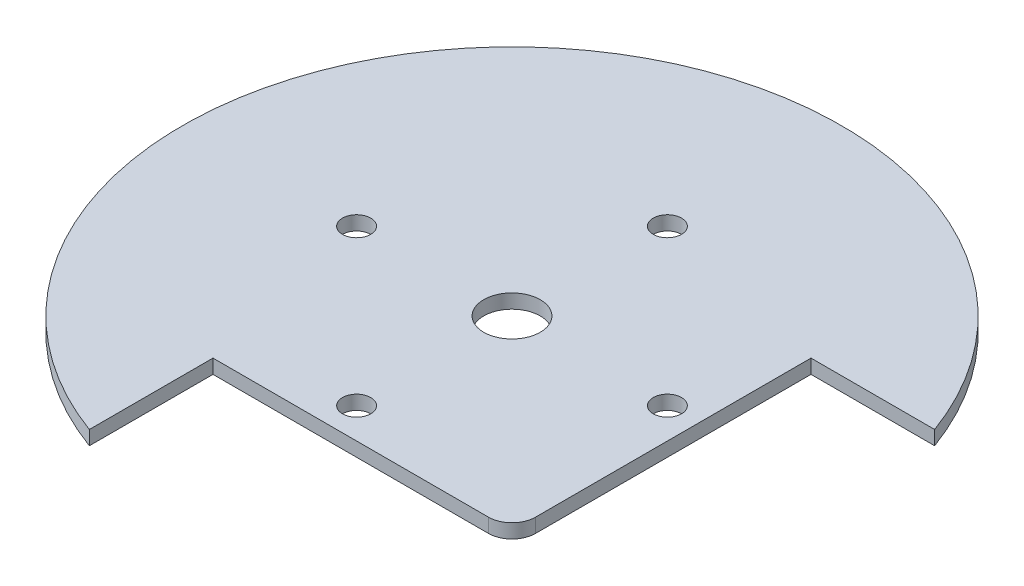
ISO-10303-21;
HEADER;
FILE_DESCRIPTION(('STEP AP214'),'2;1');
FILE_NAME('part.step','',(''),(''),'','','');
FILE_SCHEMA(('AUTOMOTIVE_DESIGN { 1 0 10303 214 1 1 1 1 }'));
ENDSEC;
DATA;
#1=APPLICATION_CONTEXT('core data for automotive mechanical design processes');
#2=APPLICATION_PROTOCOL_DEFINITION('international standard','automotive_design',2000,#1);
#3=PRODUCT_CONTEXT('',#1,'mechanical');
#4=PRODUCT('Part','Part','',(#3));
#5=PRODUCT_RELATED_PRODUCT_CATEGORY('part','',(#4));
#6=PRODUCT_DEFINITION_FORMATION('','',#4);
#7=PRODUCT_DEFINITION_CONTEXT('part definition',#1,'design');
#8=PRODUCT_DEFINITION('design','',#6,#7);
#9=PRODUCT_DEFINITION_SHAPE('','',#8);
#10=(LENGTH_UNIT() NAMED_UNIT(*) SI_UNIT(.MILLI.,.METRE.));
#11=(NAMED_UNIT(*) PLANE_ANGLE_UNIT() SI_UNIT($,.RADIAN.));
#12=(NAMED_UNIT(*) SI_UNIT($,.STERADIAN.) SOLID_ANGLE_UNIT());
#13=UNCERTAINTY_MEASURE_WITH_UNIT(LENGTH_MEASURE(1.E-05),#10,'distance_accuracy_value','');
#14=(GEOMETRIC_REPRESENTATION_CONTEXT(3) GLOBAL_UNCERTAINTY_ASSIGNED_CONTEXT((#13)) GLOBAL_UNIT_ASSIGNED_CONTEXT((#10,
#11,#12)) REPRESENTATION_CONTEXT('',''));
#15=CARTESIAN_POINT('',(0.,0.,0.));
#16=DIRECTION('',(0.,0.,1.));
#17=DIRECTION('',(1.,0.,0.));
#18=AXIS2_PLACEMENT_3D('',#15,#16,#17);
#19=CARTESIAN_POINT('',(34.4999999999993,3.,34.4999999999994));
#20=DIRECTION('',(0.,-1.,0.));
#21=DIRECTION('',(0.,0.,-1.));
#22=AXIS2_PLACEMENT_3D('',#19,#20,#21);
#23=PLANE('',#22);
#24=CARTESIAN_POINT('',(34.4999999999993,3.,34.4999999999994));
#25=DIRECTION('',(0.,1.,0.));
#26=DIRECTION('',(0.,0.,-1.));
#27=AXIS2_PLACEMENT_3D('',#24,#25,#26);
#28=CIRCLE('',#27,5.);
#29=CARTESIAN_POINT('',(34.4999999999996,3.,39.4999999999994));
#30=VERTEX_POINT('',#29);
#31=CARTESIAN_POINT('',(39.4999999999993,3.,34.4999999999996));
#32=VERTEX_POINT('',#31);
#33=EDGE_CURVE('E130',#30,#32,#28,.T.);
#34=ORIENTED_EDGE('',*,*,#33,.T.);
#35=DIRECTION('',(0.,0.,-1.));
#36=VECTOR('',#35,1.);
#37=CARTESIAN_POINT('',(39.4999999999993,3.,34.4999999999996));
#38=LINE('',#37,#36);
#39=CARTESIAN_POINT('',(39.5000000000002,3.,-23.9999999999996));
#40=VERTEX_POINT('',#39);
#41=EDGE_CURVE('E84',#32,#40,#38,.T.);
#42=ORIENTED_EDGE('',*,*,#41,.T.);
#43=DIRECTION('',(1.,0.,0.));
#44=VECTOR('',#43,1.);
#45=CARTESIAN_POINT('',(39.5000000000002,3.,-23.9999999999996));
#46=LINE('',#45,#44);
#47=CARTESIAN_POINT('',(65.7571288910946,3.,-23.9999999999993));
#48=VERTEX_POINT('',#47);
#49=EDGE_CURVE('E98',#40,#48,#46,.T.);
#50=ORIENTED_EDGE('',*,*,#49,.T.);
#51=CARTESIAN_POINT('',(0.,3.,0.));
#52=DIRECTION('',(0.,1.,0.));
#53=DIRECTION('',(0.,0.,1.));
#54=AXIS2_PLACEMENT_3D('',#51,#52,#53);
#55=CIRCLE('',#54,70.);
#56=CARTESIAN_POINT('',(-24.,3.,65.7571288910944));
#57=VERTEX_POINT('',#56);
#58=EDGE_CURVE('E91',#48,#57,#55,.T.);
#59=ORIENTED_EDGE('',*,*,#58,.T.);
#60=DIRECTION('',(0.,0.,-1.));
#61=VECTOR('',#60,1.);
#62=CARTESIAN_POINT('',(-24.,3.,39.5));
#63=LINE('',#62,#61);
#64=CARTESIAN_POINT('',(-24.,3.,39.5));
#65=VERTEX_POINT('',#64);
#66=EDGE_CURVE('E95',#57,#65,#63,.T.);
#67=ORIENTED_EDGE('',*,*,#66,.T.);
#68=DIRECTION('',(1.,0.,0.));
#69=VECTOR('',#68,1.);
#70=CARTESIAN_POINT('',(-24.,3.,39.5));
#71=LINE('',#70,#69);
#72=EDGE_CURVE('E49',#65,#30,#71,.T.);
#73=ORIENTED_EDGE('',*,*,#72,.T.);
#74=EDGE_LOOP('',(#34,#42,#50,#59,#67,#73));
#75=FACE_BOUND('',#74,.T.);
#76=CARTESIAN_POINT('',(0.,3.,0.));
#77=DIRECTION('',(0.,1.,0.));
#78=DIRECTION('',(0.,0.,1.));
#79=AXIS2_PLACEMENT_3D('',#76,#77,#78);
#80=CIRCLE('',#79,6.);
#81=CARTESIAN_POINT('',(0.,3.,6.));
#82=VERTEX_POINT('',#81);
#83=EDGE_CURVE('E122',#82,#82,#80,.T.);
#84=ORIENTED_EDGE('',*,*,#83,.F.);
#85=EDGE_LOOP('',(#84));
#86=FACE_BOUND('',#85,.T.);
#87=CARTESIAN_POINT('',(33.,3.,0.));
#88=DIRECTION('',(0.,1.,0.));
#89=DIRECTION('',(0.,0.,1.));
#90=AXIS2_PLACEMENT_3D('',#87,#88,#89);
#91=CIRCLE('',#90,3.);
#92=CARTESIAN_POINT('',(33.,3.,3.));
#93=VERTEX_POINT('',#92);
#94=EDGE_CURVE('E149',#93,#93,#91,.T.);
#95=ORIENTED_EDGE('',*,*,#94,.F.);
#96=EDGE_LOOP('',(#95));
#97=FACE_BOUND('',#96,.T.);
#98=CARTESIAN_POINT('',(-1.15218884181823E-13,3.,33.));
#99=DIRECTION('',(0.,1.,0.));
#100=DIRECTION('',(0.,0.,1.));
#101=AXIS2_PLACEMENT_3D('',#98,#99,#100);
#102=CIRCLE('',#101,3.);
#103=CARTESIAN_POINT('',(-1.15218884181823E-13,3.,36.));
#104=VERTEX_POINT('',#103);
#105=EDGE_CURVE('E155',#104,#104,#102,.T.);
#106=ORIENTED_EDGE('',*,*,#105,.F.);
#107=EDGE_LOOP('',(#106));
#108=FACE_BOUND('',#107,.T.);
#109=CARTESIAN_POINT('',(-33.,3.,-2.30437768363647E-13));
#110=DIRECTION('',(0.,1.,0.));
#111=DIRECTION('',(0.,0.,1.));
#112=AXIS2_PLACEMENT_3D('',#109,#110,#111);
#113=CIRCLE('',#112,3.);
#114=CARTESIAN_POINT('',(-33.,3.,2.99999999999977));
#115=VERTEX_POINT('',#114);
#116=EDGE_CURVE('E161',#115,#115,#113,.T.);
#117=ORIENTED_EDGE('',*,*,#116,.F.);
#118=EDGE_LOOP('',(#117));
#119=FACE_BOUND('',#118,.T.);
#120=CARTESIAN_POINT('',(3.4565665254547E-13,3.,-33.));
#121=DIRECTION('',(0.,1.,0.));
#122=DIRECTION('',(0.,0.,1.));
#123=AXIS2_PLACEMENT_3D('',#120,#121,#122);
#124=CIRCLE('',#123,3.);
#125=CARTESIAN_POINT('',(3.4565665254547E-13,3.,-30.));
#126=VERTEX_POINT('',#125);
#127=EDGE_CURVE('E167',#126,#126,#124,.T.);
#128=ORIENTED_EDGE('',*,*,#127,.F.);
#129=EDGE_LOOP('',(#128));
#130=FACE_BOUND('',#129,.T.);
#131=ADVANCED_FACE('F32',(#75,#86,#97,#108,#119,#130),#23,.F.);
#132=CARTESIAN_POINT('',(34.4999999999993,0.,34.4999999999994));
#133=DIRECTION('',(0.,-1.,0.));
#134=DIRECTION('',(0.,0.,-1.));
#135=AXIS2_PLACEMENT_3D('',#132,#133,#134);
#136=PLANE('',#135);
#137=CARTESIAN_POINT('',(-33.,0.,-2.30437768363647E-13));
#138=DIRECTION('',(0.,1.,0.));
#139=DIRECTION('',(0.,0.,1.));
#140=AXIS2_PLACEMENT_3D('',#137,#138,#139);
#141=CIRCLE('',#140,3.);
#142=CARTESIAN_POINT('',(-33.,0.,2.99999999999977));
#143=VERTEX_POINT('',#142);
#144=EDGE_CURVE('E164',#143,#143,#141,.T.);
#145=ORIENTED_EDGE('',*,*,#144,.T.);
#146=EDGE_LOOP('',(#145));
#147=FACE_BOUND('',#146,.T.);
#148=CARTESIAN_POINT('',(33.,0.,0.));
#149=DIRECTION('',(0.,1.,0.));
#150=DIRECTION('',(0.,0.,1.));
#151=AXIS2_PLACEMENT_3D('',#148,#149,#150);
#152=CIRCLE('',#151,3.);
#153=CARTESIAN_POINT('',(33.,0.,3.));
#154=VERTEX_POINT('',#153);
#155=EDGE_CURVE('E152',#154,#154,#152,.T.);
#156=ORIENTED_EDGE('',*,*,#155,.T.);
#157=EDGE_LOOP('',(#156));
#158=FACE_BOUND('',#157,.T.);
#159=CARTESIAN_POINT('',(34.4999999999993,0.,34.4999999999994));
#160=DIRECTION('',(0.,1.,0.));
#161=DIRECTION('',(0.,0.,-1.));
#162=AXIS2_PLACEMENT_3D('',#159,#160,#161);
#163=CIRCLE('',#162,5.);
#164=CARTESIAN_POINT('',(34.4999999999996,0.,39.4999999999994));
#165=VERTEX_POINT('',#164);
#166=CARTESIAN_POINT('',(39.4999999999993,0.,34.4999999999996));
#167=VERTEX_POINT('',#166);
#168=EDGE_CURVE('E118',#165,#167,#163,.T.);
#169=ORIENTED_EDGE('',*,*,#168,.F.);
#170=DIRECTION('',(1.,0.,0.));
#171=VECTOR('',#170,1.);
#172=CARTESIAN_POINT('',(24.,0.,39.5));
#173=LINE('',#172,#171);
#174=CARTESIAN_POINT('',(-24.,0.,39.5));
#175=VERTEX_POINT('',#174);
#176=EDGE_CURVE('E72',#175,#165,#173,.T.);
#177=ORIENTED_EDGE('',*,*,#176,.F.);
#178=DIRECTION('',(0.,0.,-1.));
#179=VECTOR('',#178,1.);
#180=CARTESIAN_POINT('',(-24.,0.,39.5));
#181=LINE('',#180,#179);
#182=CARTESIAN_POINT('',(-24.,0.,65.7571288910944));
#183=VERTEX_POINT('',#182);
#184=EDGE_CURVE('E127',#183,#175,#181,.T.);
#185=ORIENTED_EDGE('',*,*,#184,.F.);
#186=CARTESIAN_POINT('',(0.,0.,0.));
#187=DIRECTION('',(0.,1.,0.));
#188=DIRECTION('',(0.,0.,1.));
#189=AXIS2_PLACEMENT_3D('',#186,#187,#188);
#190=CIRCLE('',#189,70.);
#191=CARTESIAN_POINT('',(65.7571288910946,0.,-23.9999999999993));
#192=VERTEX_POINT('',#191);
#193=EDGE_CURVE('E107',#192,#183,#190,.T.);
#194=ORIENTED_EDGE('',*,*,#193,.F.);
#195=DIRECTION('',(1.,0.,0.));
#196=VECTOR('',#195,1.);
#197=CARTESIAN_POINT('',(39.5000000000002,0.,-23.9999999999996));
#198=LINE('',#197,#196);
#199=CARTESIAN_POINT('',(39.5000000000002,0.,-23.9999999999996));
#200=VERTEX_POINT('',#199);
#201=EDGE_CURVE('E124',#200,#192,#198,.T.);
#202=ORIENTED_EDGE('',*,*,#201,.F.);
#203=DIRECTION('',(0.,0.,-1.));
#204=VECTOR('',#203,1.);
#205=CARTESIAN_POINT('',(39.4999999999998,0.,24.0000000000004));
#206=LINE('',#205,#204);
#207=EDGE_CURVE('E121',#167,#200,#206,.T.);
#208=ORIENTED_EDGE('',*,*,#207,.F.);
#209=EDGE_LOOP('',(#169,#177,#185,#194,#202,#208));
#210=FACE_BOUND('',#209,.T.);
#211=CARTESIAN_POINT('',(0.,0.,0.));
#212=DIRECTION('',(0.,1.,0.));
#213=DIRECTION('',(0.,0.,1.));
#214=AXIS2_PLACEMENT_3D('',#211,#212,#213);
#215=CIRCLE('',#214,6.);
#216=CARTESIAN_POINT('',(0.,0.,6.));
#217=VERTEX_POINT('',#216);
#218=EDGE_CURVE('E146',#217,#217,#215,.T.);
#219=ORIENTED_EDGE('',*,*,#218,.T.);
#220=EDGE_LOOP('',(#219));
#221=FACE_BOUND('',#220,.T.);
#222=CARTESIAN_POINT('',(-1.15218884181823E-13,0.,33.));
#223=DIRECTION('',(0.,1.,0.));
#224=DIRECTION('',(0.,0.,1.));
#225=AXIS2_PLACEMENT_3D('',#222,#223,#224);
#226=CIRCLE('',#225,3.);
#227=CARTESIAN_POINT('',(-1.15218884181823E-13,0.,36.));
#228=VERTEX_POINT('',#227);
#229=EDGE_CURVE('E158',#228,#228,#226,.T.);
#230=ORIENTED_EDGE('',*,*,#229,.T.);
#231=EDGE_LOOP('',(#230));
#232=FACE_BOUND('',#231,.T.);
#233=CARTESIAN_POINT('',(3.4565665254547E-13,0.,-33.));
#234=DIRECTION('',(0.,1.,0.));
#235=DIRECTION('',(0.,0.,1.));
#236=AXIS2_PLACEMENT_3D('',#233,#234,#235);
#237=CIRCLE('',#236,3.);
#238=CARTESIAN_POINT('',(3.4565665254547E-13,0.,-30.));
#239=VERTEX_POINT('',#238);
#240=EDGE_CURVE('E170',#239,#239,#237,.T.);
#241=ORIENTED_EDGE('',*,*,#240,.T.);
#242=EDGE_LOOP('',(#241));
#243=FACE_BOUND('',#242,.T.);
#244=ADVANCED_FACE('F137',(#147,#158,#210,#221,#232,#243),#136,.T.);
#245=CARTESIAN_POINT('',(34.4999999999993,3.,34.4999999999994));
#246=DIRECTION('',(0.,-1.,0.));
#247=DIRECTION('',(0.,0.,-1.));
#248=AXIS2_PLACEMENT_3D('',#245,#246,#247);
#249=CYLINDRICAL_SURFACE('',#248,5.);
#250=ORIENTED_EDGE('',*,*,#168,.T.);
#251=DIRECTION('',(0.,-1.,0.));
#252=VECTOR('',#251,1.);
#253=CARTESIAN_POINT('',(39.4999999999993,3.,34.4999999999996));
#254=LINE('',#253,#252);
#255=EDGE_CURVE('E11',#32,#167,#254,.T.);
#256=ORIENTED_EDGE('',*,*,#255,.F.);
#257=ORIENTED_EDGE('',*,*,#33,.F.);
#258=DIRECTION('',(0.,-1.,0.));
#259=VECTOR('',#258,1.);
#260=CARTESIAN_POINT('',(34.4999999999996,3.,39.4999999999994));
#261=LINE('',#260,#259);
#262=EDGE_CURVE('E114',#30,#165,#261,.T.);
#263=ORIENTED_EDGE('',*,*,#262,.T.);
#264=EDGE_LOOP('',(#250,#256,#257,#263));
#265=FACE_BOUND('',#264,.T.);
#266=ADVANCED_FACE('F34',(#265),#249,.T.);
#267=CARTESIAN_POINT('',(39.4999999999998,3.,24.0000000000004));
#268=DIRECTION('',(-1.,0.,0.));
#269=DIRECTION('',(0.,0.,1.));
#270=AXIS2_PLACEMENT_3D('',#267,#268,#269);
#271=PLANE('',#270);
#272=ORIENTED_EDGE('',*,*,#207,.T.);
#273=DIRECTION('',(0.,-1.,0.));
#274=VECTOR('',#273,1.);
#275=CARTESIAN_POINT('',(39.5000000000002,3.,-23.9999999999996));
#276=LINE('',#275,#274);
#277=EDGE_CURVE('E41',#40,#200,#276,.T.);
#278=ORIENTED_EDGE('',*,*,#277,.F.);
#279=ORIENTED_EDGE('',*,*,#41,.F.);
#280=ORIENTED_EDGE('',*,*,#255,.T.);
#281=EDGE_LOOP('',(#272,#278,#279,#280));
#282=FACE_BOUND('',#281,.T.);
#283=ADVANCED_FACE('F197',(#282),#271,.F.);
#284=CARTESIAN_POINT('',(39.5000000000002,3.,-23.9999999999996));
#285=DIRECTION('',(0.,0.,-1.));
#286=DIRECTION('',(-1.,0.,0.));
#287=AXIS2_PLACEMENT_3D('',#284,#285,#286);
#288=PLANE('',#287);
#289=ORIENTED_EDGE('',*,*,#201,.T.);
#290=DIRECTION('',(0.,-1.,0.));
#291=VECTOR('',#290,1.);
#292=CARTESIAN_POINT('',(65.7571288910946,3.,-23.9999999999993));
#293=LINE('',#292,#291);
#294=EDGE_CURVE('E109',#48,#192,#293,.T.);
#295=ORIENTED_EDGE('',*,*,#294,.F.);
#296=ORIENTED_EDGE('',*,*,#49,.F.);
#297=ORIENTED_EDGE('',*,*,#277,.T.);
#298=EDGE_LOOP('',(#289,#295,#296,#297));
#299=FACE_BOUND('',#298,.T.);
#300=ADVANCED_FACE('F136',(#299),#288,.F.);
#301=CARTESIAN_POINT('',(0.,3.,0.));
#302=DIRECTION('',(0.,-1.,0.));
#303=DIRECTION('',(0.,0.,-1.));
#304=AXIS2_PLACEMENT_3D('',#301,#302,#303);
#305=CYLINDRICAL_SURFACE('',#304,70.);
#306=ORIENTED_EDGE('',*,*,#193,.T.);
#307=DIRECTION('',(0.,-1.,0.));
#308=VECTOR('',#307,1.);
#309=CARTESIAN_POINT('',(-24.,3.,65.7571288910944));
#310=LINE('',#309,#308);
#311=EDGE_CURVE('E104',#57,#183,#310,.T.);
#312=ORIENTED_EDGE('',*,*,#311,.F.);
#313=ORIENTED_EDGE('',*,*,#58,.F.);
#314=ORIENTED_EDGE('',*,*,#294,.T.);
#315=EDGE_LOOP('',(#306,#312,#313,#314));
#316=FACE_BOUND('',#315,.T.);
#317=ADVANCED_FACE('F105',(#316),#305,.T.);
#318=CARTESIAN_POINT('',(-24.,3.,39.5));
#319=DIRECTION('',(-1.,0.,0.));
#320=DIRECTION('',(0.,0.,1.));
#321=AXIS2_PLACEMENT_3D('',#318,#319,#320);
#322=PLANE('',#321);
#323=ORIENTED_EDGE('',*,*,#184,.T.);
#324=DIRECTION('',(0.,-1.,0.));
#325=VECTOR('',#324,1.);
#326=CARTESIAN_POINT('',(-24.,3.,39.5));
#327=LINE('',#326,#325);
#328=EDGE_CURVE('E110',#65,#175,#327,.T.);
#329=ORIENTED_EDGE('',*,*,#328,.F.);
#330=ORIENTED_EDGE('',*,*,#66,.F.);
#331=ORIENTED_EDGE('',*,*,#311,.T.);
#332=EDGE_LOOP('',(#323,#329,#330,#331));
#333=FACE_BOUND('',#332,.T.);
#334=ADVANCED_FACE('F112',(#333),#322,.F.);
#335=CARTESIAN_POINT('',(24.,3.,39.5));
#336=DIRECTION('',(0.,0.,-1.));
#337=DIRECTION('',(-1.,0.,0.));
#338=AXIS2_PLACEMENT_3D('',#335,#336,#337);
#339=PLANE('',#338);
#340=ORIENTED_EDGE('',*,*,#176,.T.);
#341=ORIENTED_EDGE('',*,*,#262,.F.);
#342=ORIENTED_EDGE('',*,*,#72,.F.);
#343=ORIENTED_EDGE('',*,*,#328,.T.);
#344=EDGE_LOOP('',(#340,#341,#342,#343));
#345=FACE_BOUND('',#344,.T.);
#346=ADVANCED_FACE('F139',(#345),#339,.F.);
#347=CARTESIAN_POINT('',(0.,3.,0.));
#348=DIRECTION('',(0.,-1.,0.));
#349=DIRECTION('',(0.,0.,-1.));
#350=AXIS2_PLACEMENT_3D('',#347,#348,#349);
#351=CYLINDRICAL_SURFACE('',#350,6.);
#352=ORIENTED_EDGE('',*,*,#83,.T.);
#353=EDGE_LOOP('',(#352));
#354=FACE_BOUND('',#353,.T.);
#355=ORIENTED_EDGE('',*,*,#218,.F.);
#356=EDGE_LOOP('',(#355));
#357=FACE_BOUND('',#356,.T.);
#358=ADVANCED_FACE('F187',(#354,#357),#351,.F.);
#359=CARTESIAN_POINT('',(33.,3.,0.));
#360=DIRECTION('',(0.,-1.,0.));
#361=DIRECTION('',(0.,0.,-1.));
#362=AXIS2_PLACEMENT_3D('',#359,#360,#361);
#363=CYLINDRICAL_SURFACE('',#362,3.);
#364=ORIENTED_EDGE('',*,*,#94,.T.);
#365=EDGE_LOOP('',(#364));
#366=FACE_BOUND('',#365,.T.);
#367=ORIENTED_EDGE('',*,*,#155,.F.);
#368=EDGE_LOOP('',(#367));
#369=FACE_BOUND('',#368,.T.);
#370=ADVANCED_FACE('F254',(#366,#369),#363,.F.);
#371=CARTESIAN_POINT('',(-1.15218884181823E-13,3.,33.));
#372=DIRECTION('',(0.,-1.,0.));
#373=DIRECTION('',(0.,0.,-1.));
#374=AXIS2_PLACEMENT_3D('',#371,#372,#373);
#375=CYLINDRICAL_SURFACE('',#374,3.);
#376=ORIENTED_EDGE('',*,*,#105,.T.);
#377=EDGE_LOOP('',(#376));
#378=FACE_BOUND('',#377,.T.);
#379=ORIENTED_EDGE('',*,*,#229,.F.);
#380=EDGE_LOOP('',(#379));
#381=FACE_BOUND('',#380,.T.);
#382=ADVANCED_FACE('F262',(#378,#381),#375,.F.);
#383=CARTESIAN_POINT('',(-33.,3.,-2.30437768363647E-13));
#384=DIRECTION('',(0.,-1.,0.));
#385=DIRECTION('',(0.,0.,-1.));
#386=AXIS2_PLACEMENT_3D('',#383,#384,#385);
#387=CYLINDRICAL_SURFACE('',#386,3.);
#388=ORIENTED_EDGE('',*,*,#116,.T.);
#389=EDGE_LOOP('',(#388));
#390=FACE_BOUND('',#389,.T.);
#391=ORIENTED_EDGE('',*,*,#144,.F.);
#392=EDGE_LOOP('',(#391));
#393=FACE_BOUND('',#392,.T.);
#394=ADVANCED_FACE('F270',(#390,#393),#387,.F.);
#395=CARTESIAN_POINT('',(3.4565665254547E-13,3.,-33.));
#396=DIRECTION('',(0.,-1.,0.));
#397=DIRECTION('',(0.,0.,-1.));
#398=AXIS2_PLACEMENT_3D('',#395,#396,#397);
#399=CYLINDRICAL_SURFACE('',#398,3.);
#400=ORIENTED_EDGE('',*,*,#127,.T.);
#401=EDGE_LOOP('',(#400));
#402=FACE_BOUND('',#401,.T.);
#403=ORIENTED_EDGE('',*,*,#240,.F.);
#404=EDGE_LOOP('',(#403));
#405=FACE_BOUND('',#404,.T.);
#406=ADVANCED_FACE('F176',(#402,#405),#399,.F.);
#407=CLOSED_SHELL('',(#131,#244,#266,#283,#300,#317,#334,#346,#358,#370,#382,#394,#406));
#408=MANIFOLD_SOLID_BREP('B2',#407);
#409=ADVANCED_BREP_SHAPE_REPRESENTATION('',(#18,#408),#14);
#410=SHAPE_DEFINITION_REPRESENTATION(#9,#409);
ENDSEC;
END-ISO-10303-21;
